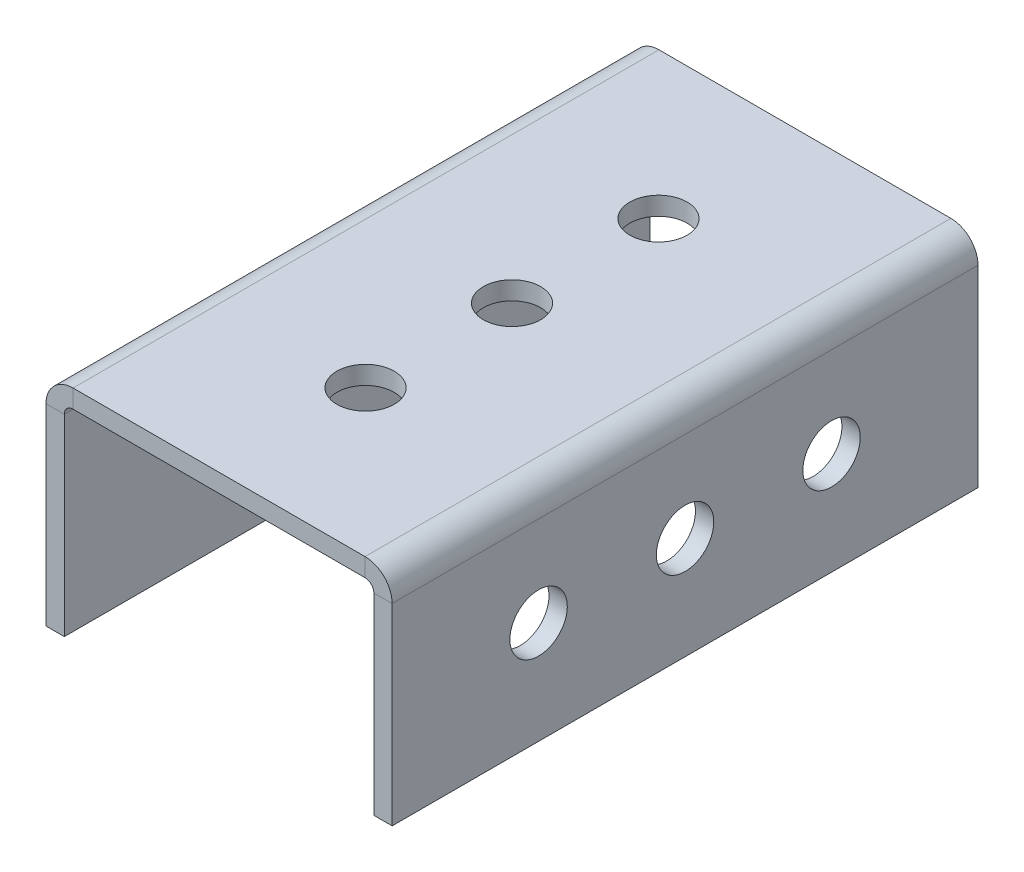
ISO-10303-21;
HEADER;
FILE_DESCRIPTION(('STEP AP214'),'2;1');
FILE_NAME('part.step','',(''),(''),'','','');
FILE_SCHEMA(('AUTOMOTIVE_DESIGN { 1 0 10303 214 1 1 1 1 }'));
ENDSEC;
DATA;
#1=APPLICATION_CONTEXT('core data for automotive mechanical design processes');
#2=APPLICATION_PROTOCOL_DEFINITION('international standard','automotive_design',2000,#1);
#3=PRODUCT_CONTEXT('',#1,'mechanical');
#4=PRODUCT('Part','Part','',(#3));
#5=PRODUCT_RELATED_PRODUCT_CATEGORY('part','',(#4));
#6=PRODUCT_DEFINITION_FORMATION('','',#4);
#7=PRODUCT_DEFINITION_CONTEXT('part definition',#1,'design');
#8=PRODUCT_DEFINITION('design','',#6,#7);
#9=PRODUCT_DEFINITION_SHAPE('','',#8);
#10=(LENGTH_UNIT() NAMED_UNIT(*) SI_UNIT(.MILLI.,.METRE.));
#11=(NAMED_UNIT(*) PLANE_ANGLE_UNIT() SI_UNIT($,.RADIAN.));
#12=(NAMED_UNIT(*) SI_UNIT($,.STERADIAN.) SOLID_ANGLE_UNIT());
#13=UNCERTAINTY_MEASURE_WITH_UNIT(LENGTH_MEASURE(1.E-05),#10,'distance_accuracy_value','');
#14=(GEOMETRIC_REPRESENTATION_CONTEXT(3) GLOBAL_UNCERTAINTY_ASSIGNED_CONTEXT((#13)) GLOBAL_UNIT_ASSIGNED_CONTEXT((#10,
#11,#12)) REPRESENTATION_CONTEXT('',''));
#15=CARTESIAN_POINT('',(0.,0.,0.));
#16=DIRECTION('',(0.,0.,1.));
#17=DIRECTION('',(1.,0.,0.));
#18=AXIS2_PLACEMENT_3D('',#15,#16,#17);
#19=CARTESIAN_POINT('',(-12.65682,19.05,50.8));
#20=DIRECTION('',(0.,0.,1.));
#21=DIRECTION('',(1.,0.,0.));
#22=AXIS2_PLACEMENT_3D('',#19,#20,#21);
#23=PLANE('',#22);
#24=DIRECTION('',(0.,-1.,0.));
#25=VECTOR('',#24,1.);
#26=CARTESIAN_POINT('',(-12.65682,19.05,50.8));
#27=LINE('',#26,#25);
#28=CARTESIAN_POINT('',(-12.65682,19.05,50.8));
#29=VERTEX_POINT('',#28);
#30=CARTESIAN_POINT('',(-12.65682,17.4625,50.8));
#31=VERTEX_POINT('',#30);
#32=EDGE_CURVE('E11',#29,#31,#27,.T.);
#33=ORIENTED_EDGE('',*,*,#32,.F.);
#34=CARTESIAN_POINT('',(-12.65682,16.7005,50.8));
#35=DIRECTION('',(0.,0.,1.));
#36=DIRECTION('',(1.,0.,0.));
#37=AXIS2_PLACEMENT_3D('',#34,#35,#36);
#38=CIRCLE('',#37,2.3495);
#39=CARTESIAN_POINT('',(-15.00632,16.7005,50.8));
#40=VERTEX_POINT('',#39);
#41=EDGE_CURVE('E302',#40,#29,#38,.F.);
#42=ORIENTED_EDGE('',*,*,#41,.F.);
#43=DIRECTION('',(-1.,0.,0.));
#44=VECTOR('',#43,1.);
#45=CARTESIAN_POINT('',(-13.41882,16.7005,50.8));
#46=LINE('',#45,#44);
#47=CARTESIAN_POINT('',(-13.41882,16.7005,50.8));
#48=VERTEX_POINT('',#47);
#49=EDGE_CURVE('E53',#48,#40,#46,.T.);
#50=ORIENTED_EDGE('',*,*,#49,.F.);
#51=CARTESIAN_POINT('',(-12.65682,16.7005,50.8));
#52=DIRECTION('',(0.,0.,1.));
#53=DIRECTION('',(1.,0.,0.));
#54=AXIS2_PLACEMENT_3D('',#51,#52,#53);
#55=CIRCLE('',#54,0.762);
#56=EDGE_CURVE('E155',#48,#31,#55,.F.);
#57=ORIENTED_EDGE('',*,*,#56,.T.);
#58=EDGE_LOOP('',(#33,#42,#50,#57));
#59=FACE_BOUND('',#58,.T.);
#60=ADVANCED_FACE('F44',(#59),#23,.T.);
#61=CARTESIAN_POINT('',(-13.41882,16.7005,50.8));
#62=DIRECTION('',(0.,0.,1.));
#63=DIRECTION('',(1.,0.,0.));
#64=AXIS2_PLACEMENT_3D('',#61,#62,#63);
#65=PLANE('',#64);
#66=DIRECTION('',(1.,0.,0.));
#67=VECTOR('',#66,1.);
#68=CARTESIAN_POINT('',(-15.00632,19.05,50.8));
#69=LINE('',#68,#67);
#70=CARTESIAN_POINT('',(12.65682,19.05,50.8));
#71=VERTEX_POINT('',#70);
#72=EDGE_CURVE('E149',#29,#71,#69,.T.);
#73=ORIENTED_EDGE('',*,*,#72,.F.);
#74=ORIENTED_EDGE('',*,*,#32,.T.);
#75=DIRECTION('',(1.,0.,0.));
#76=VECTOR('',#75,1.);
#77=CARTESIAN_POINT('',(-15.00632,17.4625,50.8));
#78=LINE('',#77,#76);
#79=CARTESIAN_POINT('',(12.65682,17.4625,50.8));
#80=VERTEX_POINT('',#79);
#81=EDGE_CURVE('E146',#31,#80,#78,.T.);
#82=ORIENTED_EDGE('',*,*,#81,.T.);
#83=DIRECTION('',(0.,1.,0.));
#84=VECTOR('',#83,1.);
#85=CARTESIAN_POINT('',(12.65682,17.4625,50.8));
#86=LINE('',#85,#84);
#87=EDGE_CURVE('E238',#80,#71,#86,.T.);
#88=ORIENTED_EDGE('',*,*,#87,.T.);
#89=EDGE_LOOP('',(#73,#74,#82,#88));
#90=FACE_BOUND('',#89,.T.);
#91=ADVANCED_FACE('F144',(#90),#65,.T.);
#92=CARTESIAN_POINT('',(-15.00632,16.7005,0.));
#93=DIRECTION('',(0.,0.,-1.));
#94=DIRECTION('',(-1.,0.,0.));
#95=AXIS2_PLACEMENT_3D('',#92,#93,#94);
#96=PLANE('',#95);
#97=DIRECTION('',(1.,0.,0.));
#98=VECTOR('',#97,1.);
#99=CARTESIAN_POINT('',(-15.00632,16.7005,0.));
#100=LINE('',#99,#98);
#101=CARTESIAN_POINT('',(-15.00632,16.7005,0.));
#102=VERTEX_POINT('',#101);
#103=CARTESIAN_POINT('',(-13.41882,16.7005,0.));
#104=VERTEX_POINT('',#103);
#105=EDGE_CURVE('E243',#102,#104,#100,.T.);
#106=ORIENTED_EDGE('',*,*,#105,.F.);
#107=CARTESIAN_POINT('',(-12.65682,16.7005,0.));
#108=DIRECTION('',(0.,0.,1.));
#109=DIRECTION('',(1.,0.,0.));
#110=AXIS2_PLACEMENT_3D('',#107,#108,#109);
#111=CIRCLE('',#110,2.3495);
#112=CARTESIAN_POINT('',(-12.65682,19.05,0.));
#113=VERTEX_POINT('',#112);
#114=EDGE_CURVE('E195',#102,#113,#111,.F.);
#115=ORIENTED_EDGE('',*,*,#114,.T.);
#116=DIRECTION('',(0.,1.,0.));
#117=VECTOR('',#116,1.);
#118=CARTESIAN_POINT('',(-12.65682,17.4625,0.));
#119=LINE('',#118,#117);
#120=CARTESIAN_POINT('',(-12.65682,17.4625,0.));
#121=VERTEX_POINT('',#120);
#122=EDGE_CURVE('E241',#121,#113,#119,.T.);
#123=ORIENTED_EDGE('',*,*,#122,.F.);
#124=CARTESIAN_POINT('',(-12.65682,16.7005,0.));
#125=DIRECTION('',(0.,0.,1.));
#126=DIRECTION('',(1.,0.,0.));
#127=AXIS2_PLACEMENT_3D('',#124,#125,#126);
#128=CIRCLE('',#127,0.762);
#129=EDGE_CURVE('E167',#104,#121,#128,.F.);
#130=ORIENTED_EDGE('',*,*,#129,.F.);
#131=EDGE_LOOP('',(#106,#115,#123,#130));
#132=FACE_BOUND('',#131,.T.);
#133=ADVANCED_FACE('F320',(#132),#96,.T.);
#134=CARTESIAN_POINT('',(-12.65682,17.4625,0.));
#135=DIRECTION('',(0.,0.,-1.));
#136=DIRECTION('',(-1.,0.,0.));
#137=AXIS2_PLACEMENT_3D('',#134,#135,#136);
#138=PLANE('',#137);
#139=DIRECTION('',(0.,1.,0.));
#140=VECTOR('',#139,1.);
#141=CARTESIAN_POINT('',(-15.00632,0.,0.));
#142=LINE('',#141,#140);
#143=CARTESIAN_POINT('',(-15.00632,0.,0.));
#144=VERTEX_POINT('',#143);
#145=EDGE_CURVE('E198',#144,#102,#142,.T.);
#146=ORIENTED_EDGE('',*,*,#145,.T.);
#147=ORIENTED_EDGE('',*,*,#105,.T.);
#148=DIRECTION('',(0.,1.,0.));
#149=VECTOR('',#148,1.);
#150=CARTESIAN_POINT('',(-13.41882,0.,0.));
#151=LINE('',#150,#149);
#152=CARTESIAN_POINT('',(-13.41882,0.,0.));
#153=VERTEX_POINT('',#152);
#154=EDGE_CURVE('E204',#153,#104,#151,.T.);
#155=ORIENTED_EDGE('',*,*,#154,.F.);
#156=DIRECTION('',(-1.,0.,0.));
#157=VECTOR('',#156,1.);
#158=CARTESIAN_POINT('',(-13.41882,0.,0.));
#159=LINE('',#158,#157);
#160=EDGE_CURVE('E201',#153,#144,#159,.T.);
#161=ORIENTED_EDGE('',*,*,#160,.T.);
#162=EDGE_LOOP('',(#146,#147,#155,#161));
#163=FACE_BOUND('',#162,.T.);
#164=ADVANCED_FACE('F370',(#163),#138,.T.);
#165=CARTESIAN_POINT('',(15.00632,16.7005,50.8));
#166=DIRECTION('',(0.,0.,1.));
#167=DIRECTION('',(1.,0.,0.));
#168=AXIS2_PLACEMENT_3D('',#165,#166,#167);
#169=PLANE('',#168);
#170=DIRECTION('',(-1.,0.,0.));
#171=VECTOR('',#170,1.);
#172=CARTESIAN_POINT('',(15.00632,16.7005,50.8));
#173=LINE('',#172,#171);
#174=CARTESIAN_POINT('',(15.00632,16.7005,50.8));
#175=VERTEX_POINT('',#174);
#176=CARTESIAN_POINT('',(13.41882,16.7005,50.8));
#177=VERTEX_POINT('',#176);
#178=EDGE_CURVE('E62',#175,#177,#173,.T.);
#179=ORIENTED_EDGE('',*,*,#178,.F.);
#180=CARTESIAN_POINT('',(12.65682,16.7005,50.8));
#181=DIRECTION('',(0.,0.,1.));
#182=DIRECTION('',(1.,0.,0.));
#183=AXIS2_PLACEMENT_3D('',#180,#181,#182);
#184=CIRCLE('',#183,2.3495);
#185=EDGE_CURVE('E298',#71,#175,#184,.F.);
#186=ORIENTED_EDGE('',*,*,#185,.F.);
#187=ORIENTED_EDGE('',*,*,#87,.F.);
#188=CARTESIAN_POINT('',(12.65682,16.7005,50.8));
#189=DIRECTION('',(0.,0.,1.));
#190=DIRECTION('',(1.,0.,0.));
#191=AXIS2_PLACEMENT_3D('',#188,#189,#190);
#192=CIRCLE('',#191,0.762);
#193=EDGE_CURVE('E175',#80,#177,#192,.F.);
#194=ORIENTED_EDGE('',*,*,#193,.T.);
#195=EDGE_LOOP('',(#179,#186,#187,#194));
#196=FACE_BOUND('',#195,.T.);
#197=ADVANCED_FACE('F375',(#196),#169,.T.);
#198=CARTESIAN_POINT('',(12.65682,17.4625,50.8));
#199=DIRECTION('',(0.,0.,1.));
#200=DIRECTION('',(1.,0.,0.));
#201=AXIS2_PLACEMENT_3D('',#198,#199,#200);
#202=PLANE('',#201);
#203=DIRECTION('',(0.,-1.,0.));
#204=VECTOR('',#203,1.);
#205=CARTESIAN_POINT('',(15.00632,19.05,50.8));
#206=LINE('',#205,#204);
#207=CARTESIAN_POINT('',(15.00632,0.,50.8));
#208=VERTEX_POINT('',#207);
#209=EDGE_CURVE('E295',#175,#208,#206,.T.);
#210=ORIENTED_EDGE('',*,*,#209,.F.);
#211=ORIENTED_EDGE('',*,*,#178,.T.);
#212=DIRECTION('',(0.,-1.,0.));
#213=VECTOR('',#212,1.);
#214=CARTESIAN_POINT('',(13.41882,19.05,50.8));
#215=LINE('',#214,#213);
#216=CARTESIAN_POINT('',(13.41882,0.,50.8));
#217=VERTEX_POINT('',#216);
#218=EDGE_CURVE('E116',#177,#217,#215,.T.);
#219=ORIENTED_EDGE('',*,*,#218,.T.);
#220=DIRECTION('',(-1.,0.,0.));
#221=VECTOR('',#220,1.);
#222=CARTESIAN_POINT('',(15.00632,0.,50.8));
#223=LINE('',#222,#221);
#224=EDGE_CURVE('E292',#208,#217,#223,.T.);
#225=ORIENTED_EDGE('',*,*,#224,.F.);
#226=EDGE_LOOP('',(#210,#211,#219,#225));
#227=FACE_BOUND('',#226,.T.);
#228=ADVANCED_FACE('F347',(#227),#202,.T.);
#229=CARTESIAN_POINT('',(12.65682,19.05,0.));
#230=DIRECTION('',(0.,0.,-1.));
#231=DIRECTION('',(-1.,0.,0.));
#232=AXIS2_PLACEMENT_3D('',#229,#230,#231);
#233=PLANE('',#232);
#234=DIRECTION('',(0.,-1.,0.));
#235=VECTOR('',#234,1.);
#236=CARTESIAN_POINT('',(12.65682,19.05,0.));
#237=LINE('',#236,#235);
#238=CARTESIAN_POINT('',(12.65682,19.05,0.));
#239=VERTEX_POINT('',#238);
#240=CARTESIAN_POINT('',(12.65682,17.4625,0.));
#241=VERTEX_POINT('',#240);
#242=EDGE_CURVE('E103',#239,#241,#237,.T.);
#243=ORIENTED_EDGE('',*,*,#242,.F.);
#244=CARTESIAN_POINT('',(12.65682,16.7005,0.));
#245=DIRECTION('',(0.,0.,1.));
#246=DIRECTION('',(1.,0.,0.));
#247=AXIS2_PLACEMENT_3D('',#244,#245,#246);
#248=CIRCLE('',#247,2.3495);
#249=CARTESIAN_POINT('',(15.00632,16.7005,0.));
#250=VERTEX_POINT('',#249);
#251=EDGE_CURVE('E191',#239,#250,#248,.F.);
#252=ORIENTED_EDGE('',*,*,#251,.T.);
#253=DIRECTION('',(1.,0.,0.));
#254=VECTOR('',#253,1.);
#255=CARTESIAN_POINT('',(13.41882,16.7005,0.));
#256=LINE('',#255,#254);
#257=CARTESIAN_POINT('',(13.41882,16.7005,0.));
#258=VERTEX_POINT('',#257);
#259=EDGE_CURVE('E110',#258,#250,#256,.T.);
#260=ORIENTED_EDGE('',*,*,#259,.F.);
#261=CARTESIAN_POINT('',(12.65682,16.7005,0.));
#262=DIRECTION('',(0.,0.,1.));
#263=DIRECTION('',(1.,0.,0.));
#264=AXIS2_PLACEMENT_3D('',#261,#262,#263);
#265=CIRCLE('',#264,0.762);
#266=EDGE_CURVE('E210',#241,#258,#265,.F.);
#267=ORIENTED_EDGE('',*,*,#266,.F.);
#268=EDGE_LOOP('',(#243,#252,#260,#267));
#269=FACE_BOUND('',#268,.T.);
#270=ADVANCED_FACE('F335',(#269),#233,.T.);
#271=CARTESIAN_POINT('',(13.41882,16.7005,0.));
#272=DIRECTION('',(0.,0.,-1.));
#273=DIRECTION('',(-1.,0.,0.));
#274=AXIS2_PLACEMENT_3D('',#271,#272,#273);
#275=PLANE('',#274);
#276=DIRECTION('',(1.,0.,0.));
#277=VECTOR('',#276,1.);
#278=CARTESIAN_POINT('',(-15.00632,19.05,0.));
#279=LINE('',#278,#277);
#280=EDGE_CURVE('E193',#113,#239,#279,.T.);
#281=ORIENTED_EDGE('',*,*,#280,.T.);
#282=ORIENTED_EDGE('',*,*,#242,.T.);
#283=DIRECTION('',(1.,0.,0.));
#284=VECTOR('',#283,1.);
#285=CARTESIAN_POINT('',(-15.00632,17.4625,0.));
#286=LINE('',#285,#284);
#287=EDGE_CURVE('E208',#121,#241,#286,.T.);
#288=ORIENTED_EDGE('',*,*,#287,.F.);
#289=ORIENTED_EDGE('',*,*,#122,.T.);
#290=EDGE_LOOP('',(#281,#282,#288,#289));
#291=FACE_BOUND('',#290,.T.);
#292=ADVANCED_FACE('F322',(#291),#275,.T.);
#293=CARTESIAN_POINT('',(13.41882,19.05,50.8));
#294=DIRECTION('',(1.,0.,0.));
#295=DIRECTION('',(0.,1.,0.));
#296=AXIS2_PLACEMENT_3D('',#293,#294,#295);
#297=PLANE('',#296);
#298=CARTESIAN_POINT('',(13.41882,8.89,12.7));
#299=DIRECTION('',(1.,0.,0.));
#300=DIRECTION('',(0.,1.,0.));
#301=AXIS2_PLACEMENT_3D('',#298,#299,#300);
#302=CIRCLE('',#301,2.4892);
#303=CARTESIAN_POINT('',(13.41882,11.3792,12.7));
#304=VERTEX_POINT('',#303);
#305=EDGE_CURVE('E185',#304,#304,#302,.T.);
#306=ORIENTED_EDGE('',*,*,#305,.T.);
#307=EDGE_LOOP('',(#306));
#308=FACE_BOUND('',#307,.T.);
#309=CARTESIAN_POINT('',(13.41882,8.89,38.1));
#310=DIRECTION('',(1.,0.,0.));
#311=DIRECTION('',(0.,1.,0.));
#312=AXIS2_PLACEMENT_3D('',#309,#310,#311);
#313=CIRCLE('',#312,2.4892);
#314=CARTESIAN_POINT('',(13.41882,11.3792,38.1));
#315=VERTEX_POINT('',#314);
#316=EDGE_CURVE('E254',#315,#315,#313,.T.);
#317=ORIENTED_EDGE('',*,*,#316,.T.);
#318=EDGE_LOOP('',(#317));
#319=FACE_BOUND('',#318,.T.);
#320=CARTESIAN_POINT('',(13.41882,8.89,25.4));
#321=DIRECTION('',(1.,0.,0.));
#322=DIRECTION('',(0.,1.,0.));
#323=AXIS2_PLACEMENT_3D('',#320,#321,#322);
#324=CIRCLE('',#323,2.4892);
#325=CARTESIAN_POINT('',(13.41882,11.3792,25.4));
#326=VERTEX_POINT('',#325);
#327=EDGE_CURVE('E249',#326,#326,#324,.T.);
#328=ORIENTED_EDGE('',*,*,#327,.T.);
#329=EDGE_LOOP('',(#328));
#330=FACE_BOUND('',#329,.T.);
#331=DIRECTION('',(0.,-1.,0.));
#332=VECTOR('',#331,1.);
#333=CARTESIAN_POINT('',(13.41882,19.05,0.));
#334=LINE('',#333,#332);
#335=CARTESIAN_POINT('',(13.41882,0.,0.));
#336=VERTEX_POINT('',#335);
#337=EDGE_CURVE('E181',#258,#336,#334,.T.);
#338=ORIENTED_EDGE('',*,*,#337,.T.);
#339=DIRECTION('',(0.,0.,-1.));
#340=VECTOR('',#339,1.);
#341=CARTESIAN_POINT('',(13.41882,0.,50.8));
#342=LINE('',#341,#340);
#343=EDGE_CURVE('E234',#217,#336,#342,.T.);
#344=ORIENTED_EDGE('',*,*,#343,.F.);
#345=ORIENTED_EDGE('',*,*,#218,.F.);
#346=DIRECTION('',(0.,0.,-1.));
#347=VECTOR('',#346,1.);
#348=CARTESIAN_POINT('',(13.41882,16.7005,50.8));
#349=LINE('',#348,#347);
#350=EDGE_CURVE('E177',#177,#258,#349,.T.);
#351=ORIENTED_EDGE('',*,*,#350,.T.);
#352=EDGE_LOOP('',(#338,#344,#345,#351));
#353=FACE_BOUND('',#352,.T.);
#354=ADVANCED_FACE('F341',(#308,#319,#330,#353),#297,.F.);
#355=CARTESIAN_POINT('',(15.00632,0.,50.8));
#356=DIRECTION('',(0.,-1.,0.));
#357=DIRECTION('',(0.,0.,-1.));
#358=AXIS2_PLACEMENT_3D('',#355,#356,#357);
#359=PLANE('',#358);
#360=DIRECTION('',(-1.,0.,0.));
#361=VECTOR('',#360,1.);
#362=CARTESIAN_POINT('',(15.00632,0.,0.));
#363=LINE('',#362,#361);
#364=CARTESIAN_POINT('',(15.00632,0.,0.));
#365=VERTEX_POINT('',#364);
#366=EDGE_CURVE('E184',#365,#336,#363,.T.);
#367=ORIENTED_EDGE('',*,*,#366,.F.);
#368=DIRECTION('',(0.,0.,-1.));
#369=VECTOR('',#368,1.);
#370=CARTESIAN_POINT('',(15.00632,0.,50.8));
#371=LINE('',#370,#369);
#372=EDGE_CURVE('E232',#208,#365,#371,.T.);
#373=ORIENTED_EDGE('',*,*,#372,.F.);
#374=ORIENTED_EDGE('',*,*,#224,.T.);
#375=ORIENTED_EDGE('',*,*,#343,.T.);
#376=EDGE_LOOP('',(#367,#373,#374,#375));
#377=FACE_BOUND('',#376,.T.);
#378=ADVANCED_FACE('F346',(#377),#359,.T.);
#379=CARTESIAN_POINT('',(15.00632,19.05,50.8));
#380=DIRECTION('',(1.,0.,0.));
#381=DIRECTION('',(0.,1.,0.));
#382=AXIS2_PLACEMENT_3D('',#379,#380,#381);
#383=PLANE('',#382);
#384=CARTESIAN_POINT('',(15.00632,8.89,12.7));
#385=DIRECTION('',(1.,0.,0.));
#386=DIRECTION('',(0.,1.,0.));
#387=AXIS2_PLACEMENT_3D('',#384,#385,#386);
#388=CIRCLE('',#387,2.4892);
#389=CARTESIAN_POINT('',(15.00632,11.3792,12.7));
#390=VERTEX_POINT('',#389);
#391=EDGE_CURVE('E270',#390,#390,#388,.T.);
#392=ORIENTED_EDGE('',*,*,#391,.F.);
#393=EDGE_LOOP('',(#392));
#394=FACE_BOUND('',#393,.T.);
#395=CARTESIAN_POINT('',(15.00632,8.89,38.1));
#396=DIRECTION('',(1.,0.,0.));
#397=DIRECTION('',(0.,1.,0.));
#398=AXIS2_PLACEMENT_3D('',#395,#396,#397);
#399=CIRCLE('',#398,2.4892);
#400=CARTESIAN_POINT('',(15.00632,11.3792,38.1));
#401=VERTEX_POINT('',#400);
#402=EDGE_CURVE('E284',#401,#401,#399,.T.);
#403=ORIENTED_EDGE('',*,*,#402,.F.);
#404=EDGE_LOOP('',(#403));
#405=FACE_BOUND('',#404,.T.);
#406=CARTESIAN_POINT('',(15.00632,8.89,25.4));
#407=DIRECTION('',(1.,0.,0.));
#408=DIRECTION('',(0.,1.,0.));
#409=AXIS2_PLACEMENT_3D('',#406,#407,#408);
#410=CIRCLE('',#409,2.4892);
#411=CARTESIAN_POINT('',(15.00632,11.3792,25.4));
#412=VERTEX_POINT('',#411);
#413=EDGE_CURVE('E281',#412,#412,#410,.T.);
#414=ORIENTED_EDGE('',*,*,#413,.F.);
#415=EDGE_LOOP('',(#414));
#416=FACE_BOUND('',#415,.T.);
#417=DIRECTION('',(0.,-1.,0.));
#418=VECTOR('',#417,1.);
#419=CARTESIAN_POINT('',(15.00632,19.05,0.));
#420=LINE('',#419,#418);
#421=EDGE_CURVE('E188',#250,#365,#420,.T.);
#422=ORIENTED_EDGE('',*,*,#421,.F.);
#423=DIRECTION('',(0.,0.,-1.));
#424=VECTOR('',#423,1.);
#425=CARTESIAN_POINT('',(15.00632,16.7005,50.8));
#426=LINE('',#425,#424);
#427=EDGE_CURVE('E229',#175,#250,#426,.T.);
#428=ORIENTED_EDGE('',*,*,#427,.F.);
#429=ORIENTED_EDGE('',*,*,#209,.T.);
#430=ORIENTED_EDGE('',*,*,#372,.T.);
#431=EDGE_LOOP('',(#422,#428,#429,#430));
#432=FACE_BOUND('',#431,.T.);
#433=ADVANCED_FACE('F349',(#394,#405,#416,#432),#383,.T.);
#434=CARTESIAN_POINT('',(12.65682,16.7005,50.8));
#435=DIRECTION('',(0.,0.,-1.));
#436=DIRECTION('',(-1.,0.,0.));
#437=AXIS2_PLACEMENT_3D('',#434,#435,#436);
#438=CYLINDRICAL_SURFACE('',#437,2.3495);
#439=ORIENTED_EDGE('',*,*,#251,.F.);
#440=DIRECTION('',(0.,0.,-1.));
#441=VECTOR('',#440,1.);
#442=CARTESIAN_POINT('',(12.65682,19.05,50.8));
#443=LINE('',#442,#441);
#444=EDGE_CURVE('E226',#71,#239,#443,.T.);
#445=ORIENTED_EDGE('',*,*,#444,.F.);
#446=ORIENTED_EDGE('',*,*,#185,.T.);
#447=ORIENTED_EDGE('',*,*,#427,.T.);
#448=EDGE_LOOP('',(#439,#445,#446,#447));
#449=FACE_BOUND('',#448,.T.);
#450=ADVANCED_FACE('F332',(#449),#438,.T.);
#451=CARTESIAN_POINT('',(-15.00632,19.05,50.8));
#452=DIRECTION('',(0.,1.,0.));
#453=DIRECTION('',(-1.,0.,0.));
#454=AXIS2_PLACEMENT_3D('',#451,#452,#453);
#455=PLANE('',#454);
#456=CARTESIAN_POINT('',(0.,19.05,12.7));
#457=DIRECTION('',(0.,1.,0.));
#458=DIRECTION('',(-1.,0.,0.));
#459=AXIS2_PLACEMENT_3D('',#456,#457,#458);
#460=CIRCLE('',#459,2.4892);
#461=CARTESIAN_POINT('',(-2.4892,19.05,12.7));
#462=VERTEX_POINT('',#461);
#463=EDGE_CURVE('E261',#462,#462,#460,.T.);
#464=ORIENTED_EDGE('',*,*,#463,.F.);
#465=EDGE_LOOP('',(#464));
#466=FACE_BOUND('',#465,.T.);
#467=CARTESIAN_POINT('',(0.,19.05,25.4));
#468=DIRECTION('',(0.,1.,0.));
#469=DIRECTION('',(-1.,0.,0.));
#470=AXIS2_PLACEMENT_3D('',#467,#468,#469);
#471=CIRCLE('',#470,2.4892);
#472=CARTESIAN_POINT('',(-2.4892,19.05,25.4));
#473=VERTEX_POINT('',#472);
#474=EDGE_CURVE('E455',#473,#473,#471,.T.);
#475=ORIENTED_EDGE('',*,*,#474,.F.);
#476=EDGE_LOOP('',(#475));
#477=FACE_BOUND('',#476,.T.);
#478=CARTESIAN_POINT('',(0.,19.05,38.1));
#479=DIRECTION('',(0.,1.,0.));
#480=DIRECTION('',(-1.,0.,0.));
#481=AXIS2_PLACEMENT_3D('',#478,#479,#480);
#482=CIRCLE('',#481,2.4892);
#483=CARTESIAN_POINT('',(-2.4892,19.05,38.1));
#484=VERTEX_POINT('',#483);
#485=EDGE_CURVE('E458',#484,#484,#482,.T.);
#486=ORIENTED_EDGE('',*,*,#485,.F.);
#487=EDGE_LOOP('',(#486));
#488=FACE_BOUND('',#487,.T.);
#489=ORIENTED_EDGE('',*,*,#280,.F.);
#490=DIRECTION('',(0.,0.,-1.));
#491=VECTOR('',#490,1.);
#492=CARTESIAN_POINT('',(-12.65682,19.05,50.8));
#493=LINE('',#492,#491);
#494=EDGE_CURVE('E223',#29,#113,#493,.T.);
#495=ORIENTED_EDGE('',*,*,#494,.F.);
#496=ORIENTED_EDGE('',*,*,#72,.T.);
#497=ORIENTED_EDGE('',*,*,#444,.T.);
#498=EDGE_LOOP('',(#489,#495,#496,#497));
#499=FACE_BOUND('',#498,.T.);
#500=ADVANCED_FACE('F327',(#466,#477,#488,#499),#455,.T.);
#501=CARTESIAN_POINT('',(-12.65682,16.7005,50.8));
#502=DIRECTION('',(0.,0.,-1.));
#503=DIRECTION('',(-1.,0.,0.));
#504=AXIS2_PLACEMENT_3D('',#501,#502,#503);
#505=CYLINDRICAL_SURFACE('',#504,2.3495);
#506=ORIENTED_EDGE('',*,*,#114,.F.);
#507=DIRECTION('',(0.,0.,-1.));
#508=VECTOR('',#507,1.);
#509=CARTESIAN_POINT('',(-15.00632,16.7005,50.8));
#510=LINE('',#509,#508);
#511=EDGE_CURVE('E220',#40,#102,#510,.T.);
#512=ORIENTED_EDGE('',*,*,#511,.F.);
#513=ORIENTED_EDGE('',*,*,#41,.T.);
#514=ORIENTED_EDGE('',*,*,#494,.T.);
#515=EDGE_LOOP('',(#506,#512,#513,#514));
#516=FACE_BOUND('',#515,.T.);
#517=ADVANCED_FACE('F325',(#516),#505,.T.);
#518=CARTESIAN_POINT('',(-15.00632,0.,50.8));
#519=DIRECTION('',(-1.,0.,0.));
#520=DIRECTION('',(0.,-1.,0.));
#521=AXIS2_PLACEMENT_3D('',#518,#519,#520);
#522=PLANE('',#521);
#523=CARTESIAN_POINT('',(-15.00632,8.89,12.7));
#524=DIRECTION('',(1.,0.,0.));
#525=DIRECTION('',(0.,1.,0.));
#526=AXIS2_PLACEMENT_3D('',#523,#524,#525);
#527=CIRCLE('',#526,2.4892);
#528=CARTESIAN_POINT('',(-15.00632,11.3792,12.7));
#529=VERTEX_POINT('',#528);
#530=EDGE_CURVE('E266',#529,#529,#527,.T.);
#531=ORIENTED_EDGE('',*,*,#530,.T.);
#532=EDGE_LOOP('',(#531));
#533=FACE_BOUND('',#532,.T.);
#534=CARTESIAN_POINT('',(-15.00632,8.89,38.1));
#535=DIRECTION('',(1.,0.,0.));
#536=DIRECTION('',(0.,1.,0.));
#537=AXIS2_PLACEMENT_3D('',#534,#535,#536);
#538=CIRCLE('',#537,2.4892);
#539=CARTESIAN_POINT('',(-15.00632,11.3792,38.1));
#540=VERTEX_POINT('',#539);
#541=EDGE_CURVE('E275',#540,#540,#538,.T.);
#542=ORIENTED_EDGE('',*,*,#541,.T.);
#543=EDGE_LOOP('',(#542));
#544=FACE_BOUND('',#543,.T.);
#545=CARTESIAN_POINT('',(-15.00632,8.89,25.4));
#546=DIRECTION('',(1.,0.,0.));
#547=DIRECTION('',(0.,1.,0.));
#548=AXIS2_PLACEMENT_3D('',#545,#546,#547);
#549=CIRCLE('',#548,2.4892);
#550=CARTESIAN_POINT('',(-15.00632,11.3792,25.4));
#551=VERTEX_POINT('',#550);
#552=EDGE_CURVE('E250',#551,#551,#549,.T.);
#553=ORIENTED_EDGE('',*,*,#552,.T.);
#554=EDGE_LOOP('',(#553));
#555=FACE_BOUND('',#554,.T.);
#556=ORIENTED_EDGE('',*,*,#145,.F.);
#557=DIRECTION('',(0.,0.,-1.));
#558=VECTOR('',#557,1.);
#559=CARTESIAN_POINT('',(-15.00632,0.,50.8));
#560=LINE('',#559,#558);
#561=CARTESIAN_POINT('',(-15.00632,0.,50.8));
#562=VERTEX_POINT('',#561);
#563=EDGE_CURVE('E218',#562,#144,#560,.T.);
#564=ORIENTED_EDGE('',*,*,#563,.F.);
#565=DIRECTION('',(0.,1.,0.));
#566=VECTOR('',#565,1.);
#567=CARTESIAN_POINT('',(-15.00632,0.,50.8));
#568=LINE('',#567,#566);
#569=EDGE_CURVE('E304',#562,#40,#568,.T.);
#570=ORIENTED_EDGE('',*,*,#569,.T.);
#571=ORIENTED_EDGE('',*,*,#511,.T.);
#572=EDGE_LOOP('',(#556,#564,#570,#571));
#573=FACE_BOUND('',#572,.T.);
#574=ADVANCED_FACE('F434',(#533,#544,#555,#573),#522,.T.);
#575=CARTESIAN_POINT('',(-13.41882,0.,50.8));
#576=DIRECTION('',(0.,-1.,0.));
#577=DIRECTION('',(1.,0.,0.));
#578=AXIS2_PLACEMENT_3D('',#575,#576,#577);
#579=PLANE('',#578);
#580=ORIENTED_EDGE('',*,*,#160,.F.);
#581=DIRECTION('',(0.,0.,-1.));
#582=VECTOR('',#581,1.);
#583=CARTESIAN_POINT('',(-13.41882,0.,50.8));
#584=LINE('',#583,#582);
#585=CARTESIAN_POINT('',(-13.41882,0.,50.8));
#586=VERTEX_POINT('',#585);
#587=EDGE_CURVE('E216',#586,#153,#584,.T.);
#588=ORIENTED_EDGE('',*,*,#587,.F.);
#589=DIRECTION('',(-1.,0.,0.));
#590=VECTOR('',#589,1.);
#591=CARTESIAN_POINT('',(-13.41882,0.,50.8));
#592=LINE('',#591,#590);
#593=EDGE_CURVE('E307',#586,#562,#592,.T.);
#594=ORIENTED_EDGE('',*,*,#593,.T.);
#595=ORIENTED_EDGE('',*,*,#563,.T.);
#596=EDGE_LOOP('',(#580,#588,#594,#595));
#597=FACE_BOUND('',#596,.T.);
#598=ADVANCED_FACE('F426',(#597),#579,.T.);
#599=CARTESIAN_POINT('',(-13.41882,0.,50.8));
#600=DIRECTION('',(-1.,0.,0.));
#601=DIRECTION('',(0.,-1.,0.));
#602=AXIS2_PLACEMENT_3D('',#599,#600,#601);
#603=PLANE('',#602);
#604=CARTESIAN_POINT('',(-13.41882,8.89,12.7));
#605=DIRECTION('',(-1.,0.,0.));
#606=DIRECTION('',(0.,-1.,0.));
#607=AXIS2_PLACEMENT_3D('',#604,#605,#606);
#608=CIRCLE('',#607,2.4892);
#609=CARTESIAN_POINT('',(-13.41882,6.4008,12.7));
#610=VERTEX_POINT('',#609);
#611=EDGE_CURVE('E255',#610,#610,#608,.T.);
#612=ORIENTED_EDGE('',*,*,#611,.T.);
#613=EDGE_LOOP('',(#612));
#614=FACE_BOUND('',#613,.T.);
#615=CARTESIAN_POINT('',(-13.41882,8.89,38.1));
#616=DIRECTION('',(-1.,0.,0.));
#617=DIRECTION('',(0.,-1.,0.));
#618=AXIS2_PLACEMENT_3D('',#615,#616,#617);
#619=CIRCLE('',#618,2.4892);
#620=CARTESIAN_POINT('',(-13.41882,6.4008,38.1));
#621=VERTEX_POINT('',#620);
#622=EDGE_CURVE('E251',#621,#621,#619,.T.);
#623=ORIENTED_EDGE('',*,*,#622,.T.);
#624=EDGE_LOOP('',(#623));
#625=FACE_BOUND('',#624,.T.);
#626=CARTESIAN_POINT('',(-13.41882,8.89,25.4));
#627=DIRECTION('',(-1.,0.,0.));
#628=DIRECTION('',(0.,-1.,0.));
#629=AXIS2_PLACEMENT_3D('',#626,#627,#628);
#630=CIRCLE('',#629,2.4892);
#631=CARTESIAN_POINT('',(-13.41882,6.4008,25.4));
#632=VERTEX_POINT('',#631);
#633=EDGE_CURVE('E246',#632,#632,#630,.T.);
#634=ORIENTED_EDGE('',*,*,#633,.T.);
#635=EDGE_LOOP('',(#634));
#636=FACE_BOUND('',#635,.T.);
#637=ORIENTED_EDGE('',*,*,#154,.T.);
#638=DIRECTION('',(0.,0.,-1.));
#639=VECTOR('',#638,1.);
#640=CARTESIAN_POINT('',(-13.41882,16.7005,50.8));
#641=LINE('',#640,#639);
#642=EDGE_CURVE('E169',#48,#104,#641,.T.);
#643=ORIENTED_EDGE('',*,*,#642,.F.);
#644=DIRECTION('',(0.,1.,0.));
#645=VECTOR('',#644,1.);
#646=CARTESIAN_POINT('',(-13.41882,0.,50.8));
#647=LINE('',#646,#645);
#648=EDGE_CURVE('E160',#586,#48,#647,.T.);
#649=ORIENTED_EDGE('',*,*,#648,.F.);
#650=ORIENTED_EDGE('',*,*,#587,.T.);
#651=EDGE_LOOP('',(#637,#643,#649,#650));
#652=FACE_BOUND('',#651,.T.);
#653=ADVANCED_FACE('F317',(#614,#625,#636,#652),#603,.F.);
#654=CARTESIAN_POINT('',(-12.65682,16.7005,50.8));
#655=DIRECTION('',(0.,0.,-1.));
#656=DIRECTION('',(-1.,0.,0.));
#657=AXIS2_PLACEMENT_3D('',#654,#655,#656);
#658=CYLINDRICAL_SURFACE('',#657,0.762);
#659=ORIENTED_EDGE('',*,*,#129,.T.);
#660=DIRECTION('',(0.,0.,-1.));
#661=VECTOR('',#660,1.);
#662=CARTESIAN_POINT('',(-12.65682,17.4625,50.8));
#663=LINE('',#662,#661);
#664=EDGE_CURVE('E164',#31,#121,#663,.T.);
#665=ORIENTED_EDGE('',*,*,#664,.F.);
#666=ORIENTED_EDGE('',*,*,#56,.F.);
#667=ORIENTED_EDGE('',*,*,#642,.T.);
#668=EDGE_LOOP('',(#659,#665,#666,#667));
#669=FACE_BOUND('',#668,.T.);
#670=ADVANCED_FACE('F165',(#669),#658,.F.);
#671=CARTESIAN_POINT('',(-15.00632,17.4625,50.8));
#672=DIRECTION('',(0.,1.,0.));
#673=DIRECTION('',(-1.,0.,0.));
#674=AXIS2_PLACEMENT_3D('',#671,#672,#673);
#675=PLANE('',#674);
#676=CARTESIAN_POINT('',(0.,17.4625,12.7));
#677=DIRECTION('',(0.,1.,0.));
#678=DIRECTION('',(-1.,0.,0.));
#679=AXIS2_PLACEMENT_3D('',#676,#677,#678);
#680=CIRCLE('',#679,2.4892);
#681=CARTESIAN_POINT('',(-2.4892,17.4625,12.7));
#682=VERTEX_POINT('',#681);
#683=EDGE_CURVE('E47',#682,#682,#680,.T.);
#684=ORIENTED_EDGE('',*,*,#683,.T.);
#685=EDGE_LOOP('',(#684));
#686=FACE_BOUND('',#685,.T.);
#687=CARTESIAN_POINT('',(0.,17.4625,25.4));
#688=DIRECTION('',(0.,1.,0.));
#689=DIRECTION('',(-1.,0.,0.));
#690=AXIS2_PLACEMENT_3D('',#687,#688,#689);
#691=CIRCLE('',#690,2.4892);
#692=CARTESIAN_POINT('',(-2.4892,17.4625,25.4));
#693=VERTEX_POINT('',#692);
#694=EDGE_CURVE('E260',#693,#693,#691,.T.);
#695=ORIENTED_EDGE('',*,*,#694,.T.);
#696=EDGE_LOOP('',(#695));
#697=FACE_BOUND('',#696,.T.);
#698=CARTESIAN_POINT('',(0.,17.4625,38.1));
#699=DIRECTION('',(0.,1.,0.));
#700=DIRECTION('',(-1.,0.,0.));
#701=AXIS2_PLACEMENT_3D('',#698,#699,#700);
#702=CIRCLE('',#701,2.4892);
#703=CARTESIAN_POINT('',(-2.4892,17.4625,38.1));
#704=VERTEX_POINT('',#703);
#705=EDGE_CURVE('E258',#704,#704,#702,.T.);
#706=ORIENTED_EDGE('',*,*,#705,.T.);
#707=EDGE_LOOP('',(#706));
#708=FACE_BOUND('',#707,.T.);
#709=ORIENTED_EDGE('',*,*,#287,.T.);
#710=DIRECTION('',(0.,0.,-1.));
#711=VECTOR('',#710,1.);
#712=CARTESIAN_POINT('',(12.65682,17.4625,50.8));
#713=LINE('',#712,#711);
#714=EDGE_CURVE('E170',#80,#241,#713,.T.);
#715=ORIENTED_EDGE('',*,*,#714,.F.);
#716=ORIENTED_EDGE('',*,*,#81,.F.);
#717=ORIENTED_EDGE('',*,*,#664,.T.);
#718=EDGE_LOOP('',(#709,#715,#716,#717));
#719=FACE_BOUND('',#718,.T.);
#720=ADVANCED_FACE('F172',(#686,#697,#708,#719),#675,.F.);
#721=CARTESIAN_POINT('',(12.65682,16.7005,50.8));
#722=DIRECTION('',(0.,0.,-1.));
#723=DIRECTION('',(-1.,0.,0.));
#724=AXIS2_PLACEMENT_3D('',#721,#722,#723);
#725=CYLINDRICAL_SURFACE('',#724,0.762);
#726=ORIENTED_EDGE('',*,*,#266,.T.);
#727=ORIENTED_EDGE('',*,*,#350,.F.);
#728=ORIENTED_EDGE('',*,*,#193,.F.);
#729=ORIENTED_EDGE('',*,*,#714,.T.);
#730=EDGE_LOOP('',(#726,#727,#728,#729));
#731=FACE_BOUND('',#730,.T.);
#732=ADVANCED_FACE('F338',(#731),#725,.F.);
#733=CARTESIAN_POINT('',(12.65682,16.7005,50.8));
#734=DIRECTION('',(0.,0.,1.));
#735=DIRECTION('',(1.,0.,0.));
#736=AXIS2_PLACEMENT_3D('',#733,#734,#735);
#737=PLANE('',#736);
#738=ORIENTED_EDGE('',*,*,#648,.T.);
#739=ORIENTED_EDGE('',*,*,#49,.T.);
#740=ORIENTED_EDGE('',*,*,#569,.F.);
#741=ORIENTED_EDGE('',*,*,#593,.F.);
#742=EDGE_LOOP('',(#738,#739,#740,#741));
#743=FACE_BOUND('',#742,.T.);
#744=ADVANCED_FACE('F313',(#743),#737,.T.);
#745=CARTESIAN_POINT('',(12.65682,16.7005,0.));
#746=DIRECTION('',(0.,0.,1.));
#747=DIRECTION('',(1.,0.,0.));
#748=AXIS2_PLACEMENT_3D('',#745,#746,#747);
#749=PLANE('',#748);
#750=ORIENTED_EDGE('',*,*,#337,.F.);
#751=ORIENTED_EDGE('',*,*,#259,.T.);
#752=ORIENTED_EDGE('',*,*,#421,.T.);
#753=ORIENTED_EDGE('',*,*,#366,.T.);
#754=EDGE_LOOP('',(#750,#751,#752,#753));
#755=FACE_BOUND('',#754,.T.);
#756=ADVANCED_FACE('F343',(#755),#749,.F.);
#757=CARTESIAN_POINT('',(-15.00632,8.89,25.4));
#758=DIRECTION('',(1.,0.,0.));
#759=DIRECTION('',(0.,1.,0.));
#760=AXIS2_PLACEMENT_3D('',#757,#758,#759);
#761=CYLINDRICAL_SURFACE('',#760,2.4892);
#762=ORIENTED_EDGE('',*,*,#552,.F.);
#763=EDGE_LOOP('',(#762));
#764=FACE_BOUND('',#763,.T.);
#765=ORIENTED_EDGE('',*,*,#633,.F.);
#766=EDGE_LOOP('',(#765));
#767=FACE_BOUND('',#766,.T.);
#768=ADVANCED_FACE('F402',(#764,#767),#761,.F.);
#769=CARTESIAN_POINT('',(-15.00632,8.89,38.1));
#770=DIRECTION('',(1.,0.,0.));
#771=DIRECTION('',(0.,1.,0.));
#772=AXIS2_PLACEMENT_3D('',#769,#770,#771);
#773=CYLINDRICAL_SURFACE('',#772,2.4892);
#774=ORIENTED_EDGE('',*,*,#541,.F.);
#775=EDGE_LOOP('',(#774));
#776=FACE_BOUND('',#775,.T.);
#777=ORIENTED_EDGE('',*,*,#622,.F.);
#778=EDGE_LOOP('',(#777));
#779=FACE_BOUND('',#778,.T.);
#780=ADVANCED_FACE('F410',(#776,#779),#773,.F.);
#781=CARTESIAN_POINT('',(-15.00632,8.89,12.7));
#782=DIRECTION('',(1.,0.,0.));
#783=DIRECTION('',(0.,1.,0.));
#784=AXIS2_PLACEMENT_3D('',#781,#782,#783);
#785=CYLINDRICAL_SURFACE('',#784,2.4892);
#786=ORIENTED_EDGE('',*,*,#530,.F.);
#787=EDGE_LOOP('',(#786));
#788=FACE_BOUND('',#787,.T.);
#789=ORIENTED_EDGE('',*,*,#611,.F.);
#790=EDGE_LOOP('',(#789));
#791=FACE_BOUND('',#790,.T.);
#792=ADVANCED_FACE('F399',(#788,#791),#785,.F.);
#793=ORIENTED_EDGE('',*,*,#413,.T.);
#794=EDGE_LOOP('',(#793));
#795=FACE_BOUND('',#794,.T.);
#796=ORIENTED_EDGE('',*,*,#327,.F.);
#797=EDGE_LOOP('',(#796));
#798=FACE_BOUND('',#797,.T.);
#799=ADVANCED_FACE('F396',(#795,#798),#761,.F.);
#800=ORIENTED_EDGE('',*,*,#402,.T.);
#801=EDGE_LOOP('',(#800));
#802=FACE_BOUND('',#801,.T.);
#803=ORIENTED_EDGE('',*,*,#316,.F.);
#804=EDGE_LOOP('',(#803));
#805=FACE_BOUND('',#804,.T.);
#806=ADVANCED_FACE('F398',(#802,#805),#773,.F.);
#807=ORIENTED_EDGE('',*,*,#391,.T.);
#808=EDGE_LOOP('',(#807));
#809=FACE_BOUND('',#808,.T.);
#810=ORIENTED_EDGE('',*,*,#305,.F.);
#811=EDGE_LOOP('',(#810));
#812=FACE_BOUND('',#811,.T.);
#813=ADVANCED_FACE('F407',(#809,#812),#785,.F.);
#814=CARTESIAN_POINT('',(0.,0.,38.1));
#815=DIRECTION('',(0.,1.,0.));
#816=DIRECTION('',(-1.,0.,0.));
#817=AXIS2_PLACEMENT_3D('',#814,#815,#816);
#818=CYLINDRICAL_SURFACE('',#817,2.4892);
#819=ORIENTED_EDGE('',*,*,#485,.T.);
#820=EDGE_LOOP('',(#819));
#821=FACE_BOUND('',#820,.T.);
#822=ORIENTED_EDGE('',*,*,#705,.F.);
#823=EDGE_LOOP('',(#822));
#824=FACE_BOUND('',#823,.T.);
#825=ADVANCED_FACE('F487',(#821,#824),#818,.F.);
#826=CARTESIAN_POINT('',(0.,0.,25.4));
#827=DIRECTION('',(0.,1.,0.));
#828=DIRECTION('',(-1.,0.,0.));
#829=AXIS2_PLACEMENT_3D('',#826,#827,#828);
#830=CYLINDRICAL_SURFACE('',#829,2.4892);
#831=ORIENTED_EDGE('',*,*,#474,.T.);
#832=EDGE_LOOP('',(#831));
#833=FACE_BOUND('',#832,.T.);
#834=ORIENTED_EDGE('',*,*,#694,.F.);
#835=EDGE_LOOP('',(#834));
#836=FACE_BOUND('',#835,.T.);
#837=ADVANCED_FACE('F482',(#833,#836),#830,.F.);
#838=CARTESIAN_POINT('',(0.,0.,12.7));
#839=DIRECTION('',(0.,1.,0.));
#840=DIRECTION('',(-1.,0.,0.));
#841=AXIS2_PLACEMENT_3D('',#838,#839,#840);
#842=CYLINDRICAL_SURFACE('',#841,2.4892);
#843=ORIENTED_EDGE('',*,*,#463,.T.);
#844=EDGE_LOOP('',(#843));
#845=FACE_BOUND('',#844,.T.);
#846=ORIENTED_EDGE('',*,*,#683,.F.);
#847=EDGE_LOOP('',(#846));
#848=FACE_BOUND('',#847,.T.);
#849=ADVANCED_FACE('F479',(#845,#848),#842,.F.);
#850=CLOSED_SHELL('',(#60,#91,#133,#164,#197,#228,#270,#292,#354,#378,#433,#450,#500,#517,#574,
#598,#653,#670,#720,#732,#744,#756,#768,#780,#792,#799,#806,#813,#825,#837,#849));
#851=MANIFOLD_SOLID_BREP('B2',#850);
#852=ADVANCED_BREP_SHAPE_REPRESENTATION('',(#18,#851),#14);
#853=SHAPE_DEFINITION_REPRESENTATION(#9,#852);
ENDSEC;
END-ISO-10303-21;
